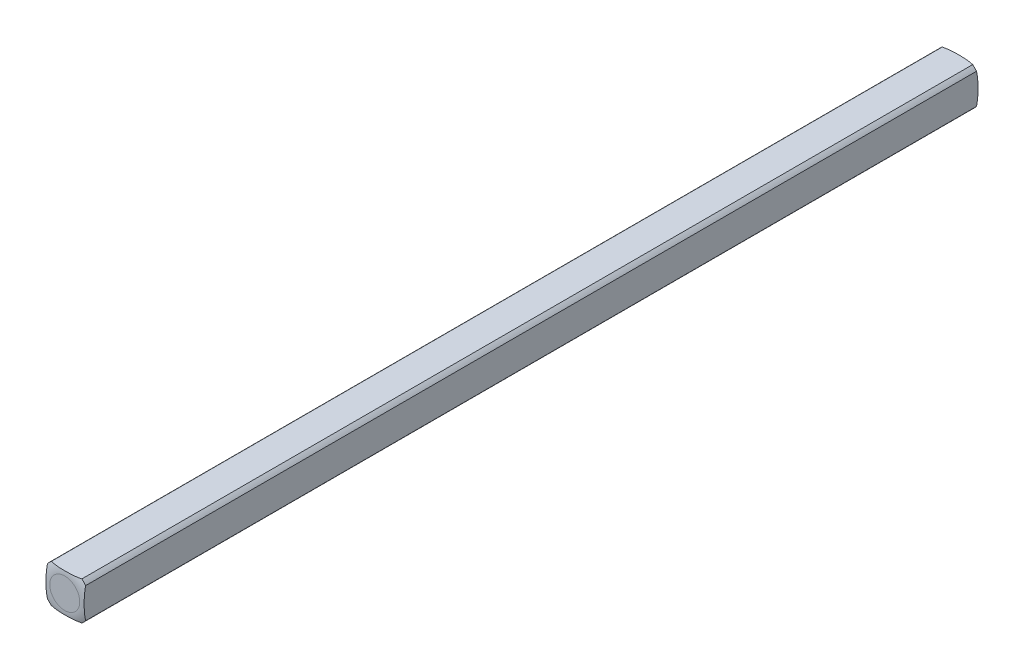
ISO-10303-21;
HEADER;
FILE_DESCRIPTION(('STEP AP214'),'2;1');
FILE_NAME('part.step','',(''),(''),'','','');
FILE_SCHEMA(('AUTOMOTIVE_DESIGN { 1 0 10303 214 1 1 1 1 }'));
ENDSEC;
DATA;
#1=APPLICATION_CONTEXT('core data for automotive mechanical design processes');
#2=APPLICATION_PROTOCOL_DEFINITION('international standard','automotive_design',2000,#1);
#3=PRODUCT_CONTEXT('',#1,'mechanical');
#4=PRODUCT('Part','Part','',(#3));
#5=PRODUCT_RELATED_PRODUCT_CATEGORY('part','',(#4));
#6=PRODUCT_DEFINITION_FORMATION('','',#4);
#7=PRODUCT_DEFINITION_CONTEXT('part definition',#1,'design');
#8=PRODUCT_DEFINITION('design','',#6,#7);
#9=PRODUCT_DEFINITION_SHAPE('','',#8);
#10=(LENGTH_UNIT() NAMED_UNIT(*) SI_UNIT(.MILLI.,.METRE.));
#11=(NAMED_UNIT(*) PLANE_ANGLE_UNIT() SI_UNIT($,.RADIAN.));
#12=(NAMED_UNIT(*) SI_UNIT($,.STERADIAN.) SOLID_ANGLE_UNIT());
#13=UNCERTAINTY_MEASURE_WITH_UNIT(LENGTH_MEASURE(1.E-05),#10,'distance_accuracy_value','');
#14=(GEOMETRIC_REPRESENTATION_CONTEXT(3) GLOBAL_UNCERTAINTY_ASSIGNED_CONTEXT((#13)) GLOBAL_UNIT_ASSIGNED_CONTEXT((#10,
#11,#12)) REPRESENTATION_CONTEXT('',''));
#15=CARTESIAN_POINT('',(0.,0.,0.));
#16=DIRECTION('',(0.,0.,1.));
#17=DIRECTION('',(1.,0.,0.));
#18=AXIS2_PLACEMENT_3D('',#15,#16,#17);
#19=CARTESIAN_POINT('',(-1.5875,-1.5875,37.211));
#20=DIRECTION('',(0.,1.,0.));
#21=DIRECTION('',(0.,0.,1.));
#22=AXIS2_PLACEMENT_3D('',#19,#20,#21);
#23=PLANE('',#22);
#24=CARTESIAN_POINT('',(1.26841150657032,-1.5875,-37.059919142098));
#25=CARTESIAN_POINT('',(1.22720105040827,-1.5875,-37.0701762604742));
#26=CARTESIAN_POINT('',(1.18578761357714,-1.5875,-37.0795927535058));
#27=CARTESIAN_POINT('',(1.10271120238514,-1.5875,-37.096861071626));
#28=CARTESIAN_POINT('',(1.06104879805324,-1.5875,-37.1047156312752));
#29=CARTESIAN_POINT('',(0.977511179219644,-1.5875,-37.1190074369776));
#30=CARTESIAN_POINT('',(0.935636116351978,-1.5875,-37.12544557827));
#31=CARTESIAN_POINT('',(0.85195632596747,-1.5875,-37.1370202217379));
#32=CARTESIAN_POINT('',(0.810152608329594,-1.5875,-37.1421640837943));
#33=CARTESIAN_POINT('',(0.726405135779092,-1.5875,-37.1513448983346));
#34=CARTESIAN_POINT('',(0.684461324130969,-1.5875,-37.1553813277516));
#35=CARTESIAN_POINT('',(0.600471089740472,-1.5875,-37.1624873965405));
#36=CARTESIAN_POINT('',(0.55842462478368,-1.5875,-37.1655565288188));
#37=CARTESIAN_POINT('',(0.442316252980614,-1.5875,-37.172876819996));
#38=CARTESIAN_POINT('',(0.368199297688235,-1.5875,-37.1762546095867));
#39=CARTESIAN_POINT('',(0.219899169562756,-1.5875,-37.1810241426145));
#40=CARTESIAN_POINT('',(0.145715990031034,-1.5875,-37.1824156550284));
#41=CARTESIAN_POINT('',(-0.00261925426802478,-1.5875,-37.1835115381934));
#42=CARTESIAN_POINT('',(-0.0767713119995585,-1.5875,-37.1832168909072));
#43=CARTESIAN_POINT('',(-0.22505583427011,-1.5875,-37.1808755268396));
#44=CARTESIAN_POINT('',(-0.299188296702211,-1.5875,-37.1788286662978));
#45=CARTESIAN_POINT('',(-0.44849139385935,-1.5875,-37.172519272075));
#46=CARTESIAN_POINT('',(-0.523660700911162,-1.5875,-37.1682235679572));
#47=CARTESIAN_POINT('',(-0.673772419103432,-1.5875,-37.1567011997426));
#48=CARTESIAN_POINT('',(-0.74871487412263,-1.5875,-37.1494751445196));
#49=CARTESIAN_POINT('',(-0.873294781040694,-1.5875,-37.1343054206116));
#50=CARTESIAN_POINT('',(-0.923058303404124,-1.5875,-37.1273998036191));
#51=CARTESIAN_POINT('',(-1.02230885751262,-1.5875,-37.1116736221696));
#52=CARTESIAN_POINT('',(-1.07179576173138,-1.5875,-37.1028522389467));
#53=CARTESIAN_POINT('',(-1.17042027552899,-1.5875,-37.0830571345187));
#54=CARTESIAN_POINT('',(-1.2195571747518,-1.58749999999998,-37.072079888906));
#55=CARTESIAN_POINT('',(-1.26841150657033,-1.58749999999996,-37.059919142098));
#56=B_SPLINE_CURVE_WITH_KNOTS('',3,(#24,#25,#26,#27,#28,#29,#30,#31,#32,#33,#34,#35,#36,#37,#38,
#39,#40,#41,#42,#43,#44,#45,#46,#47,#48,#49,#50,#51,#52,#53,#54,#55),.UNSPECIFIED.,.F.,.F.,(4,2,
2,2,2,2,2,2,2,2,2,2,2,2,2,4),(0.,0.12738566921495,0.254546315061895,0.381626357369329,
0.507966543484096,0.634366300757393,0.760832211740227,0.983375124489411,1.20594391900471,
1.42838311012148,1.65084055299026,1.87667574497213,2.10246403651328,2.25315484465146,
2.40391018266842,2.55491405868559),.UNSPECIFIED.);
#57=CARTESIAN_POINT('',(1.26841150657032,-1.5875,-37.059919142098));
#58=VERTEX_POINT('',#57);
#59=CARTESIAN_POINT('',(-1.26841150657032,-1.5875,-37.059919142098));
#60=VERTEX_POINT('',#59);
#61=EDGE_CURVE('E112',#58,#60,#56,.T.);
#62=ORIENTED_EDGE('',*,*,#61,.F.);
#63=DIRECTION('',(0.,0.,1.));
#64=VECTOR('',#63,1.);
#65=CARTESIAN_POINT('',(1.26841150657032,-1.5875,-37.211));
#66=LINE('',#65,#64);
#67=CARTESIAN_POINT('',(1.26841150657032,-1.5875,37.059919142098));
#68=VERTEX_POINT('',#67);
#69=EDGE_CURVE('E122',#68,#58,#66,.F.);
#70=ORIENTED_EDGE('',*,*,#69,.F.);
#71=CARTESIAN_POINT('',(-1.26841150657032,-1.5875,37.059919142098));
#72=CARTESIAN_POINT('',(-1.22720105040827,-1.5875,37.0701762604742));
#73=CARTESIAN_POINT('',(-1.18578761357714,-1.5875,37.0795927535058));
#74=CARTESIAN_POINT('',(-1.10271120238514,-1.5875,37.096861071626));
#75=CARTESIAN_POINT('',(-1.06104879805324,-1.5875,37.1047156312752));
#76=CARTESIAN_POINT('',(-0.977511179219647,-1.5875,37.1190074369776));
#77=CARTESIAN_POINT('',(-0.935636116351981,-1.5875,37.12544557827));
#78=CARTESIAN_POINT('',(-0.851956325967475,-1.5875,37.1370202217379));
#79=CARTESIAN_POINT('',(-0.810152608329599,-1.5875,37.1421640837943));
#80=CARTESIAN_POINT('',(-0.726405135779099,-1.5875,37.1513448983346));
#81=CARTESIAN_POINT('',(-0.684461324130976,-1.5875,37.1553813277516));
#82=CARTESIAN_POINT('',(-0.600471089740481,-1.5875,37.1624873965405));
#83=CARTESIAN_POINT('',(-0.558424624783689,-1.5875,37.1655565288188));
#84=CARTESIAN_POINT('',(-0.442316252980623,-1.5875,37.172876819996));
#85=CARTESIAN_POINT('',(-0.368199297688244,-1.5875,37.1762546095867));
#86=CARTESIAN_POINT('',(-0.219899169562765,-1.5875,37.1810241426145));
#87=CARTESIAN_POINT('',(-0.145715990031042,-1.5875,37.1824156550284));
#88=CARTESIAN_POINT('',(0.00261925426801704,-1.5875,37.1835115381934));
#89=CARTESIAN_POINT('',(0.076771311999551,-1.5875,37.1832168909072));
#90=CARTESIAN_POINT('',(0.225055834270103,-1.5875,37.1808755268396));
#91=CARTESIAN_POINT('',(0.299188296702204,-1.5875,37.1788286662978));
#92=CARTESIAN_POINT('',(0.448491393859344,-1.5875,37.172519272075));
#93=CARTESIAN_POINT('',(0.523660700911156,-1.5875,37.1682235679572));
#94=CARTESIAN_POINT('',(0.673772419103427,-1.5875,37.1567011997426));
#95=CARTESIAN_POINT('',(0.748714874122625,-1.5875,37.1494751445196));
#96=CARTESIAN_POINT('',(0.873294781040689,-1.5875,37.1343054206116));
#97=CARTESIAN_POINT('',(0.92305830340412,-1.5875,37.1273998036191));
#98=CARTESIAN_POINT('',(1.02230885751262,-1.5875,37.1116736221696));
#99=CARTESIAN_POINT('',(1.07179576173137,-1.5875,37.1028522389467));
#100=CARTESIAN_POINT('',(1.17042027552899,-1.5875,37.0830571345187));
#101=CARTESIAN_POINT('',(1.21955717475179,-1.58749999999998,37.072079888906));
#102=CARTESIAN_POINT('',(1.26841150657032,-1.58749999999996,37.059919142098));
#103=B_SPLINE_CURVE_WITH_KNOTS('',3,(#71,#72,#73,#74,#75,#76,#77,#78,#79,#80,#81,#82,#83,#84,
#85,#86,#87,#88,#89,#90,#91,#92,#93,#94,#95,#96,#97,#98,#99,#100,#101,#102),.UNSPECIFIED.,.F.,
.F.,(4,2,2,2,2,2,2,2,2,2,2,2,2,2,2,4),(0.,0.127385669214948,0.254546315061892,0.381626357369324,
0.507966543484089,0.634366300757384,0.760832211740216,0.9833751244894,1.2059439190047,
1.42838311012148,1.65084055299025,1.87667574497213,2.10246403651327,2.25315484465145,
2.40391018266841,2.55491405868559),.UNSPECIFIED.);
#104=CARTESIAN_POINT('',(-1.26841150657032,-1.5875,37.059919142098));
#105=VERTEX_POINT('',#104);
#106=EDGE_CURVE('E87',#105,#68,#103,.T.);
#107=ORIENTED_EDGE('',*,*,#106,.F.);
#108=DIRECTION('',(0.,0.,1.));
#109=VECTOR('',#108,1.);
#110=CARTESIAN_POINT('',(-1.26841150657032,-1.5875,-37.211));
#111=LINE('',#110,#109);
#112=EDGE_CURVE('E111',#60,#105,#111,.T.);
#113=ORIENTED_EDGE('',*,*,#112,.F.);
#114=EDGE_LOOP('',(#62,#70,#107,#113));
#115=FACE_BOUND('',#114,.T.);
#116=ADVANCED_FACE('F16',(#115),#23,.F.);
#117=CARTESIAN_POINT('',(0.,0.,-37.211));
#118=DIRECTION('',(0.,0.,1.));
#119=DIRECTION('',(1.,0.,0.));
#120=AXIS2_PLACEMENT_3D('',#117,#118,#119);
#121=CYLINDRICAL_SURFACE('',#120,2.032);
#122=CARTESIAN_POINT('',(0.,0.,37.059919142098));
#123=DIRECTION('',(0.,0.,1.));
#124=DIRECTION('',(1.,0.,0.));
#125=AXIS2_PLACEMENT_3D('',#122,#123,#124);
#126=CIRCLE('',#125,2.032);
#127=CARTESIAN_POINT('',(-1.5875,-1.26841150657032,37.059919142098));
#128=VERTEX_POINT('',#127);
#129=EDGE_CURVE('E96',#105,#128,#126,.F.);
#130=ORIENTED_EDGE('',*,*,#129,.T.);
#131=DIRECTION('',(0.,0.,-1.));
#132=VECTOR('',#131,1.);
#133=CARTESIAN_POINT('',(-1.5875,-1.26841150657032,37.211));
#134=LINE('',#133,#132);
#135=CARTESIAN_POINT('',(-1.5875,-1.26841150657032,-37.059919142098));
#136=VERTEX_POINT('',#135);
#137=EDGE_CURVE('E109',#128,#136,#134,.T.);
#138=ORIENTED_EDGE('',*,*,#137,.T.);
#139=CARTESIAN_POINT('',(0.,0.,-37.059919142098));
#140=DIRECTION('',(0.,0.,1.));
#141=DIRECTION('',(1.,0.,0.));
#142=AXIS2_PLACEMENT_3D('',#139,#140,#141);
#143=CIRCLE('',#142,2.032);
#144=EDGE_CURVE('E279',#60,#136,#143,.F.);
#145=ORIENTED_EDGE('',*,*,#144,.F.);
#146=ORIENTED_EDGE('',*,*,#112,.T.);
#147=EDGE_LOOP('',(#130,#138,#145,#146));
#148=FACE_BOUND('',#147,.T.);
#149=ADVANCED_FACE('F107',(#148),#121,.T.);
#150=CARTESIAN_POINT('',(0.,0.,-37.211));
#151=DIRECTION('',(0.,0.,1.));
#152=DIRECTION('',(1.,0.,0.));
#153=AXIS2_PLACEMENT_3D('',#150,#151,#152);
#154=CYLINDRICAL_SURFACE('',#153,2.032);
#155=CARTESIAN_POINT('',(0.,0.,37.059919142098));
#156=DIRECTION('',(0.,0.,1.));
#157=DIRECTION('',(1.,0.,0.));
#158=AXIS2_PLACEMENT_3D('',#155,#156,#157);
#159=CIRCLE('',#158,2.032);
#160=CARTESIAN_POINT('',(1.5875,-1.26841150657032,37.059919142098));
#161=VERTEX_POINT('',#160);
#162=EDGE_CURVE('E278',#161,#68,#159,.F.);
#163=ORIENTED_EDGE('',*,*,#162,.T.);
#164=ORIENTED_EDGE('',*,*,#69,.T.);
#165=CARTESIAN_POINT('',(0.,0.,-37.059919142098));
#166=DIRECTION('',(0.,0.,1.));
#167=DIRECTION('',(1.,0.,0.));
#168=AXIS2_PLACEMENT_3D('',#165,#166,#167);
#169=CIRCLE('',#168,2.032);
#170=CARTESIAN_POINT('',(1.5875,-1.26841150657032,-37.059919142098));
#171=VERTEX_POINT('',#170);
#172=EDGE_CURVE('E167',#58,#171,#169,.T.);
#173=ORIENTED_EDGE('',*,*,#172,.T.);
#174=DIRECTION('',(0.,0.,1.));
#175=VECTOR('',#174,1.);
#176=CARTESIAN_POINT('',(1.5875,-1.26841150657032,37.211));
#177=LINE('',#176,#175);
#178=EDGE_CURVE('E189',#171,#161,#177,.T.);
#179=ORIENTED_EDGE('',*,*,#178,.T.);
#180=EDGE_LOOP('',(#163,#164,#173,#179));
#181=FACE_BOUND('',#180,.T.);
#182=ADVANCED_FACE('F149',(#181),#154,.T.);
#183=CARTESIAN_POINT('',(-1.5875,1.5875,37.211));
#184=DIRECTION('',(0.,0.,-1.));
#185=DIRECTION('',(-1.,0.,0.));
#186=AXIS2_PLACEMENT_3D('',#183,#184,#185);
#187=PLANE('',#186);
#188=CARTESIAN_POINT('',(0.,0.,37.211));
#189=DIRECTION('',(0.,0.,-1.));
#190=DIRECTION('',(1.,0.,0.));
#191=AXIS2_PLACEMENT_3D('',#188,#189,#190);
#192=CIRCLE('',#191,1.24506403026729);
#193=CARTESIAN_POINT('',(1.24506403026729,0.,37.211));
#194=VERTEX_POINT('',#193);
#195=CARTESIAN_POINT('',(-1.24506403026729,0.,37.211));
#196=VERTEX_POINT('',#195);
#197=EDGE_CURVE('E117',#194,#196,#192,.T.);
#198=ORIENTED_EDGE('',*,*,#197,.F.);
#199=CARTESIAN_POINT('',(0.,0.,37.211));
#200=DIRECTION('',(0.,0.,-1.));
#201=DIRECTION('',(-1.,0.,0.));
#202=AXIS2_PLACEMENT_3D('',#199,#200,#201);
#203=CIRCLE('',#202,1.24506403026729);
#204=EDGE_CURVE('E163',#196,#194,#203,.T.);
#205=ORIENTED_EDGE('',*,*,#204,.F.);
#206=EDGE_LOOP('',(#198,#205));
#207=FACE_BOUND('',#206,.T.);
#208=ADVANCED_FACE('F139',(#207),#187,.F.);
#209=CARTESIAN_POINT('',(-1.5875,-1.5875,37.211));
#210=DIRECTION('',(1.,0.,0.));
#211=DIRECTION('',(0.,0.,-1.));
#212=AXIS2_PLACEMENT_3D('',#209,#210,#211);
#213=PLANE('',#212);
#214=CARTESIAN_POINT('',(-1.5875,-1.26841150657032,-37.059919142098));
#215=CARTESIAN_POINT('',(-1.5875,-1.1449330903041,-37.0906460633221));
#216=CARTESIAN_POINT('',(-1.5875,-1.01998399304383,-37.1137556661494));
#217=CARTESIAN_POINT('',(-1.5875,-0.768859486803923,-37.1485369425311));
#218=CARTESIAN_POINT('',(-1.5875,-0.642689416140628,-37.160245727962));
#219=CARTESIAN_POINT('',(-1.5875,-0.430424575859619,-37.1736252995166));
#220=CARTESIAN_POINT('',(-1.5875,-0.344419790998911,-37.1773089066951));
#221=CARTESIAN_POINT('',(-1.5875,-0.172275750609256,-37.1821119883047));
#222=CARTESIAN_POINT('',(-1.5875,-0.0861364440860026,-37.1832298028463));
#223=CARTESIAN_POINT('',(-1.5875,0.0708815141524197,-37.1832253528724));
#224=CARTESIAN_POINT('',(-1.5875,0.141761089973269,-37.1824647503116));
#225=CARTESIAN_POINT('',(-1.5875,0.283443517066233,-37.1792632283593));
#226=CARTESIAN_POINT('',(-1.5875,0.354246388904852,-37.1768233071219));
#227=CARTESIAN_POINT('',(-1.5875,0.495806846039993,-37.1698353290476));
#228=CARTESIAN_POINT('',(-1.5875,0.566564357181161,-37.1652856874328));
#229=CARTESIAN_POINT('',(-1.5875,0.707839358368324,-37.1534687398624));
#230=CARTESIAN_POINT('',(-1.5875,0.77835691039061,-37.1462021995255));
#231=CARTESIAN_POINT('',(-1.5875,0.91922385926538,-37.1282291029893));
#232=CARTESIAN_POINT('',(-1.5875,0.989571770847696,-37.1175104282261));
#233=CARTESIAN_POINT('',(-1.5875,1.12959917493505,-37.0919650360794));
#234=CARTESIAN_POINT('',(-1.5875,1.19927774910522,-37.0771333317905));
#235=CARTESIAN_POINT('',(-1.5875,1.26841150657032,-37.059919142098));
#236=B_SPLINE_CURVE_WITH_KNOTS('',3,(#214,#215,#216,#217,#218,#219,#220,#221,#222,#223,#224,
#225,#226,#227,#228,#229,#230,#231,#232,#233,#234,#235),.UNSPECIFIED.,.F.,.F.,(4,2,2,2,2,2,2,2,
2,2,4),(0.,0.380919121752895,0.760594090647793,1.01882661939087,1.27722615960104,
1.48986264420096,1.70237285085079,1.91504294996344,2.12765316402353,2.34101802413352,
2.55464272138866),.UNSPECIFIED.);
#237=CARTESIAN_POINT('',(-1.5875,1.26841150657032,-37.059919142098));
#238=VERTEX_POINT('',#237);
#239=EDGE_CURVE('E115',#136,#238,#236,.T.);
#240=ORIENTED_EDGE('',*,*,#239,.F.);
#241=ORIENTED_EDGE('',*,*,#137,.F.);
#242=CARTESIAN_POINT('',(-1.5875,1.26841150657032,37.059919142098));
#243=CARTESIAN_POINT('',(-1.5875,1.1449330903041,37.0906460633221));
#244=CARTESIAN_POINT('',(-1.5875,1.01998399304384,37.1137556661494));
#245=CARTESIAN_POINT('',(-1.5875,0.768859486803937,37.1485369425311));
#246=CARTESIAN_POINT('',(-1.5875,0.642689416140646,37.160245727962));
#247=CARTESIAN_POINT('',(-1.5875,0.430424575859638,37.1736252995166));
#248=CARTESIAN_POINT('',(-1.5875,0.344419790998926,37.1773089066951));
#249=CARTESIAN_POINT('',(-1.5875,0.172275750609264,37.1821119883047));
#250=CARTESIAN_POINT('',(-1.5875,0.0861364440860064,37.1832298028463));
#251=CARTESIAN_POINT('',(-1.5875,-0.0708815141524197,37.1832253528724));
#252=CARTESIAN_POINT('',(-1.5875,-0.141761089973269,37.1824647503116));
#253=CARTESIAN_POINT('',(-1.5875,-0.283443517066233,37.1792632283593));
#254=CARTESIAN_POINT('',(-1.5875,-0.354246388904852,37.1768233071219));
#255=CARTESIAN_POINT('',(-1.5875,-0.495806846039993,37.1698353290476));
#256=CARTESIAN_POINT('',(-1.5875,-0.566564357181161,37.1652856874328));
#257=CARTESIAN_POINT('',(-1.5875,-0.707839358368324,37.1534687398624));
#258=CARTESIAN_POINT('',(-1.5875,-0.77835691039061,37.1462021995255));
#259=CARTESIAN_POINT('',(-1.5875,-0.91922385926538,37.1282291029893));
#260=CARTESIAN_POINT('',(-1.5875,-0.989571770847696,37.1175104282261));
#261=CARTESIAN_POINT('',(-1.5875,-1.12959917493505,37.0919650360794));
#262=CARTESIAN_POINT('',(-1.5875,-1.19927774910522,37.0771333317905));
#263=CARTESIAN_POINT('',(-1.5875,-1.26841150657032,37.059919142098));
#264=B_SPLINE_CURVE_WITH_KNOTS('',3,(#242,#243,#244,#245,#246,#247,#248,#249,#250,#251,#252,
#253,#254,#255,#256,#257,#258,#259,#260,#261,#262,#263),.UNSPECIFIED.,.F.,.F.,(4,2,2,2,2,2,2,2,
2,2,4),(0.,0.380919121752883,0.760594090647769,1.01882661939086,1.27722615960103,
1.48986264420096,1.70237285085079,1.91504294996343,2.12765316402352,2.34101802413351,
2.55464272138866),.UNSPECIFIED.);
#265=CARTESIAN_POINT('',(-1.5875,1.26841150657032,37.059919142098));
#266=VERTEX_POINT('',#265);
#267=EDGE_CURVE('E92',#266,#128,#264,.T.);
#268=ORIENTED_EDGE('',*,*,#267,.F.);
#269=DIRECTION('',(0.,0.,1.));
#270=VECTOR('',#269,1.);
#271=CARTESIAN_POINT('',(-1.5875,1.26841150657032,-37.211));
#272=LINE('',#271,#270);
#273=EDGE_CURVE('E102',#238,#266,#272,.T.);
#274=ORIENTED_EDGE('',*,*,#273,.F.);
#275=EDGE_LOOP('',(#240,#241,#268,#274));
#276=FACE_BOUND('',#275,.T.);
#277=ADVANCED_FACE('F114',(#276),#213,.F.);
#278=CARTESIAN_POINT('',(-1.5875,1.5875,-37.211));
#279=DIRECTION('',(0.,0.,-1.));
#280=DIRECTION('',(-1.,0.,0.));
#281=AXIS2_PLACEMENT_3D('',#278,#279,#280);
#282=PLANE('',#281);
#283=CARTESIAN_POINT('',(0.,0.,-37.211));
#284=DIRECTION('',(0.,0.,1.));
#285=DIRECTION('',(1.,0.,0.));
#286=AXIS2_PLACEMENT_3D('',#283,#284,#285);
#287=CIRCLE('',#286,1.24506403026729);
#288=CARTESIAN_POINT('',(1.24506403026729,0.,-37.211));
#289=VERTEX_POINT('',#288);
#290=CARTESIAN_POINT('',(-1.24506403026729,0.,-37.211));
#291=VERTEX_POINT('',#290);
#292=EDGE_CURVE('E202',#289,#291,#287,.T.);
#293=ORIENTED_EDGE('',*,*,#292,.F.);
#294=CARTESIAN_POINT('',(0.,0.,-37.211));
#295=DIRECTION('',(0.,0.,1.));
#296=DIRECTION('',(-1.,0.,0.));
#297=AXIS2_PLACEMENT_3D('',#294,#295,#296);
#298=CIRCLE('',#297,1.24506403026729);
#299=EDGE_CURVE('E119',#289,#291,#298,.F.);
#300=ORIENTED_EDGE('',*,*,#299,.T.);
#301=EDGE_LOOP('',(#293,#300));
#302=FACE_BOUND('',#301,.T.);
#303=ADVANCED_FACE('F207',(#302),#282,.T.);
#304=CARTESIAN_POINT('',(1.5875,-1.5875,37.211));
#305=DIRECTION('',(-1.,0.,0.));
#306=DIRECTION('',(0.,0.,1.));
#307=AXIS2_PLACEMENT_3D('',#304,#305,#306);
#308=PLANE('',#307);
#309=ORIENTED_EDGE('',*,*,#178,.F.);
#310=CARTESIAN_POINT('',(1.5875,1.26841150657032,-37.059919142098));
#311=CARTESIAN_POINT('',(1.5875,1.1449330903041,-37.0906460633221));
#312=CARTESIAN_POINT('',(1.5875,1.01998399304383,-37.1137556661494));
#313=CARTESIAN_POINT('',(1.5875,0.768859486803923,-37.1485369425311));
#314=CARTESIAN_POINT('',(1.5875,0.642689416140628,-37.160245727962));
#315=CARTESIAN_POINT('',(1.5875,0.43042457585962,-37.1736252995166));
#316=CARTESIAN_POINT('',(1.5875,0.344419790998911,-37.1773089066951));
#317=CARTESIAN_POINT('',(1.5875,0.172275750609257,-37.1821119883047));
#318=CARTESIAN_POINT('',(1.5875,0.0861364440860028,-37.1832298028463));
#319=CARTESIAN_POINT('',(1.5875,-0.0708815141524195,-37.1832253528724));
#320=CARTESIAN_POINT('',(1.5875,-0.141761089973269,-37.1824647503116));
#321=CARTESIAN_POINT('',(1.5875,-0.283443517066233,-37.1792632283593));
#322=CARTESIAN_POINT('',(1.5875,-0.354246388904852,-37.1768233071219));
#323=CARTESIAN_POINT('',(1.5875,-0.495806846039992,-37.1698353290476));
#324=CARTESIAN_POINT('',(1.5875,-0.566564357181161,-37.1652856874328));
#325=CARTESIAN_POINT('',(1.5875,-0.707839358368324,-37.1534687398624));
#326=CARTESIAN_POINT('',(1.5875,-0.778356910390611,-37.1462021995255));
#327=CARTESIAN_POINT('',(1.5875,-0.919223859265381,-37.1282291029893));
#328=CARTESIAN_POINT('',(1.5875,-0.989571770847697,-37.1175104282261));
#329=CARTESIAN_POINT('',(1.5875,-1.12959917493506,-37.0919650360794));
#330=CARTESIAN_POINT('',(1.5875,-1.19927774910522,-37.0771333317905));
#331=CARTESIAN_POINT('',(1.5875,-1.26841150657033,-37.059919142098));
#332=B_SPLINE_CURVE_WITH_KNOTS('',3,(#310,#311,#312,#313,#314,#315,#316,#317,#318,#319,#320,
#321,#322,#323,#324,#325,#326,#327,#328,#329,#330,#331),.UNSPECIFIED.,.F.,.F.,(4,2,2,2,2,2,2,2,
2,2,4),(0.,0.380919121752895,0.760594090647793,1.01882661939087,1.27722615960104,
1.48986264420096,1.70237285085079,1.91504294996344,2.12765316402353,2.34101802413352,
2.55464272138866),.UNSPECIFIED.);
#333=CARTESIAN_POINT('',(1.5875,1.26841150657032,-37.059919142098));
#334=VERTEX_POINT('',#333);
#335=EDGE_CURVE('E230',#334,#171,#332,.T.);
#336=ORIENTED_EDGE('',*,*,#335,.F.);
#337=DIRECTION('',(0.,0.,1.));
#338=VECTOR('',#337,1.);
#339=CARTESIAN_POINT('',(1.5875,1.26841150657032,-37.211));
#340=LINE('',#339,#338);
#341=CARTESIAN_POINT('',(1.5875,1.26841150657032,37.059919142098));
#342=VERTEX_POINT('',#341);
#343=EDGE_CURVE('E192',#342,#334,#340,.F.);
#344=ORIENTED_EDGE('',*,*,#343,.F.);
#345=CARTESIAN_POINT('',(1.5875,-1.26841150657032,37.059919142098));
#346=CARTESIAN_POINT('',(1.5875,-1.1449330903041,37.0906460633221));
#347=CARTESIAN_POINT('',(1.5875,-1.01998399304383,37.1137556661494));
#348=CARTESIAN_POINT('',(1.5875,-0.768859486803923,37.1485369425311));
#349=CARTESIAN_POINT('',(1.5875,-0.642689416140628,37.160245727962));
#350=CARTESIAN_POINT('',(1.5875,-0.43042457585962,37.1736252995166));
#351=CARTESIAN_POINT('',(1.5875,-0.344419790998911,37.1773089066951));
#352=CARTESIAN_POINT('',(1.5875,-0.172275750609257,37.1821119883047));
#353=CARTESIAN_POINT('',(1.5875,-0.0861364440860028,37.1832298028463));
#354=CARTESIAN_POINT('',(1.5875,0.0708815141524194,37.1832253528724));
#355=CARTESIAN_POINT('',(1.5875,0.141761089973268,37.1824647503116));
#356=CARTESIAN_POINT('',(1.5875,0.283443517066233,37.1792632283593));
#357=CARTESIAN_POINT('',(1.5875,0.354246388904852,37.1768233071219));
#358=CARTESIAN_POINT('',(1.5875,0.495806846039992,37.1698353290476));
#359=CARTESIAN_POINT('',(1.5875,0.56656435718116,37.1652856874328));
#360=CARTESIAN_POINT('',(1.5875,0.707839358368323,37.1534687398624));
#361=CARTESIAN_POINT('',(1.5875,0.778356910390609,37.1462021995255));
#362=CARTESIAN_POINT('',(1.5875,0.919223859265379,37.1282291029893));
#363=CARTESIAN_POINT('',(1.5875,0.989571770847695,37.1175104282261));
#364=CARTESIAN_POINT('',(1.5875,1.12959917493505,37.0919650360794));
#365=CARTESIAN_POINT('',(1.5875,1.19927774910522,37.0771333317905));
#366=CARTESIAN_POINT('',(1.5875,1.26841150657032,37.059919142098));
#367=B_SPLINE_CURVE_WITH_KNOTS('',3,(#345,#346,#347,#348,#349,#350,#351,#352,#353,#354,#355,
#356,#357,#358,#359,#360,#361,#362,#363,#364,#365,#366),.UNSPECIFIED.,.F.,.F.,(4,2,2,2,2,2,2,2,
2,2,4),(0.,0.380919121752895,0.760594090647793,1.01882661939087,1.27722615960104,
1.48986264420096,1.70237285085079,1.91504294996343,2.12765316402352,2.34101802413351,
2.55464272138866),.UNSPECIFIED.);
#368=EDGE_CURVE('E103',#161,#342,#367,.T.);
#369=ORIENTED_EDGE('',*,*,#368,.F.);
#370=EDGE_LOOP('',(#309,#336,#344,#369));
#371=FACE_BOUND('',#370,.T.);
#372=ADVANCED_FACE('F180',(#371),#308,.F.);
#373=CARTESIAN_POINT('',(1.24506403026729,0.,35.086));
#374=DIRECTION('',(0.,-1.,0.));
#375=DIRECTION('',(1.,0.,0.));
#376=AXIS2_PLACEMENT_3D('',#373,#374,#375);
#377=CIRCLE('',#376,2.125);
#378=TRIMMED_CURVE('',#377,(PARAMETER_VALUE(-2.19680193092879)),
(PARAMETER_VALUE(2.19680193092879)),.T.,.PARAMETER.);
#379=CARTESIAN_POINT('',(0.,0.,35.086));
#380=DIRECTION('',(0.,0.,-1.));
#381=AXIS1_PLACEMENT('',#379,#380);
#382=SURFACE_OF_REVOLUTION('',#378,#381);
#383=ORIENTED_EDGE('',*,*,#267,.T.);
#384=ORIENTED_EDGE('',*,*,#129,.F.);
#385=ORIENTED_EDGE('',*,*,#106,.T.);
#386=ORIENTED_EDGE('',*,*,#162,.F.);
#387=ORIENTED_EDGE('',*,*,#368,.T.);
#388=CARTESIAN_POINT('',(0.,0.,37.059919142098));
#389=DIRECTION('',(0.,0.,1.));
#390=DIRECTION('',(1.,0.,0.));
#391=AXIS2_PLACEMENT_3D('',#388,#389,#390);
#392=CIRCLE('',#391,2.032);
#393=CARTESIAN_POINT('',(1.26841150657032,1.5875,37.059919142098));
#394=VERTEX_POINT('',#393);
#395=EDGE_CURVE('E195',#394,#342,#392,.F.);
#396=ORIENTED_EDGE('',*,*,#395,.F.);
#397=CARTESIAN_POINT('',(1.26841150657032,1.5875,37.059919142098));
#398=CARTESIAN_POINT('',(1.22720105040827,1.5875,37.0701762604742));
#399=CARTESIAN_POINT('',(1.18578761357714,1.5875,37.0795927535058));
#400=CARTESIAN_POINT('',(1.10271120238514,1.5875,37.096861071626));
#401=CARTESIAN_POINT('',(1.06104879805324,1.5875,37.1047156312752));
#402=CARTESIAN_POINT('',(0.977511179219644,1.5875,37.1190074369776));
#403=CARTESIAN_POINT('',(0.935636116351978,1.5875,37.12544557827));
#404=CARTESIAN_POINT('',(0.85195632596747,1.5875,37.1370202217379));
#405=CARTESIAN_POINT('',(0.810152608329594,1.5875,37.1421640837943));
#406=CARTESIAN_POINT('',(0.726405135779092,1.5875,37.1513448983346));
#407=CARTESIAN_POINT('',(0.684461324130969,1.5875,37.1553813277516));
#408=CARTESIAN_POINT('',(0.600471089740472,1.5875,37.1624873965405));
#409=CARTESIAN_POINT('',(0.55842462478368,1.5875,37.1655565288188));
#410=CARTESIAN_POINT('',(0.442316252980614,1.5875,37.172876819996));
#411=CARTESIAN_POINT('',(0.368199297688235,1.5875,37.1762546095867));
#412=CARTESIAN_POINT('',(0.219899169562756,1.5875,37.1810241426145));
#413=CARTESIAN_POINT('',(0.145715990031034,1.5875,37.1824156550284));
#414=CARTESIAN_POINT('',(-0.00261925426802464,1.5875,37.1835115381934));
#415=CARTESIAN_POINT('',(-0.0767713119995583,1.5875,37.1832168909072));
#416=CARTESIAN_POINT('',(-0.225055834270109,1.5875,37.1808755268396));
#417=CARTESIAN_POINT('',(-0.299188296702211,1.5875,37.1788286662978));
#418=CARTESIAN_POINT('',(-0.44849139385935,1.5875,37.172519272075));
#419=CARTESIAN_POINT('',(-0.523660700911162,1.5875,37.1682235679572));
#420=CARTESIAN_POINT('',(-0.673772419103432,1.5875,37.1567011997426));
#421=CARTESIAN_POINT('',(-0.748714874122629,1.5875,37.1494751445196));
#422=CARTESIAN_POINT('',(-0.873294781040694,1.5875,37.1343054206116));
#423=CARTESIAN_POINT('',(-0.923058303404124,1.5875,37.1273998036191));
#424=CARTESIAN_POINT('',(-1.02230885751262,1.5875,37.1116736221696));
#425=CARTESIAN_POINT('',(-1.07179576173138,1.5875,37.1028522389467));
#426=CARTESIAN_POINT('',(-1.17042027552899,1.5875,37.0830571345187));
#427=CARTESIAN_POINT('',(-1.2195571747518,1.58749999999998,37.072079888906));
#428=CARTESIAN_POINT('',(-1.26841150657033,1.58749999999996,37.059919142098));
#429=B_SPLINE_CURVE_WITH_KNOTS('',3,(#397,#398,#399,#400,#401,#402,#403,#404,#405,#406,#407,
#408,#409,#410,#411,#412,#413,#414,#415,#416,#417,#418,#419,#420,#421,#422,#423,#424,#425,#426,
#427,#428),.UNSPECIFIED.,.F.,.F.,(4,2,2,2,2,2,2,2,2,2,2,2,2,2,2,4),(0.,0.12738566921495,
0.254546315061895,0.381626357369329,0.507966543484096,0.634366300757393,0.760832211740227,
0.983375124489411,1.20594391900471,1.42838311012148,1.65084055299026,1.87667574497213,
2.10246403651328,2.25315484465146,2.40391018266841,2.55491405868559),.UNSPECIFIED.);
#430=CARTESIAN_POINT('',(-1.26841150657032,1.5875,37.059919142098));
#431=VERTEX_POINT('',#430);
#432=EDGE_CURVE('E194',#394,#431,#429,.T.);
#433=ORIENTED_EDGE('',*,*,#432,.T.);
#434=CARTESIAN_POINT('',(0.,0.,37.059919142098));
#435=DIRECTION('',(0.,0.,1.));
#436=DIRECTION('',(1.,0.,0.));
#437=AXIS2_PLACEMENT_3D('',#434,#435,#436);
#438=CIRCLE('',#437,2.032);
#439=EDGE_CURVE('E98',#266,#431,#438,.F.);
#440=ORIENTED_EDGE('',*,*,#439,.F.);
#441=EDGE_LOOP('',(#383,#384,#385,#386,#387,#396,#433,#440));
#442=FACE_BOUND('',#441,.T.);
#443=ORIENTED_EDGE('',*,*,#197,.T.);
#444=ORIENTED_EDGE('',*,*,#204,.T.);
#445=EDGE_LOOP('',(#443,#444));
#446=FACE_BOUND('',#445,.T.);
#447=ADVANCED_FACE('F94',(#442,#446),#382,.F.);
#448=CARTESIAN_POINT('',(0.,0.,-37.211));
#449=DIRECTION('',(0.,0.,1.));
#450=DIRECTION('',(1.,0.,0.));
#451=AXIS2_PLACEMENT_3D('',#448,#449,#450);
#452=CYLINDRICAL_SURFACE('',#451,2.032);
#453=ORIENTED_EDGE('',*,*,#439,.T.);
#454=DIRECTION('',(0.,0.,-1.));
#455=VECTOR('',#454,1.);
#456=CARTESIAN_POINT('',(-1.26841150657032,1.5875,37.211));
#457=LINE('',#456,#455);
#458=CARTESIAN_POINT('',(-1.26841150657032,1.5875,-37.059919142098));
#459=VERTEX_POINT('',#458);
#460=EDGE_CURVE('E235',#431,#459,#457,.T.);
#461=ORIENTED_EDGE('',*,*,#460,.T.);
#462=CARTESIAN_POINT('',(0.,0.,-37.059919142098));
#463=DIRECTION('',(0.,0.,1.));
#464=DIRECTION('',(1.,0.,0.));
#465=AXIS2_PLACEMENT_3D('',#462,#463,#464);
#466=CIRCLE('',#465,2.032);
#467=EDGE_CURVE('E229',#238,#459,#466,.F.);
#468=ORIENTED_EDGE('',*,*,#467,.F.);
#469=ORIENTED_EDGE('',*,*,#273,.T.);
#470=EDGE_LOOP('',(#453,#461,#468,#469));
#471=FACE_BOUND('',#470,.T.);
#472=ADVANCED_FACE('F179',(#471),#452,.T.);
#473=CARTESIAN_POINT('',(1.24506403026729,0.,-35.086));
#474=DIRECTION('',(0.,1.,0.));
#475=DIRECTION('',(1.,0.,0.));
#476=AXIS2_PLACEMENT_3D('',#473,#474,#475);
#477=CIRCLE('',#476,2.125);
#478=TRIMMED_CURVE('',#477,(PARAMETER_VALUE(-2.19680193092879)),
(PARAMETER_VALUE(2.19680193092879)),.T.,.PARAMETER.);
#479=CARTESIAN_POINT('',(0.,0.,-35.086));
#480=DIRECTION('',(0.,0.,1.));
#481=AXIS1_PLACEMENT('',#479,#480);
#482=SURFACE_OF_REVOLUTION('',#478,#481);
#483=ORIENTED_EDGE('',*,*,#292,.T.);
#484=ORIENTED_EDGE('',*,*,#299,.F.);
#485=EDGE_LOOP('',(#483,#484));
#486=FACE_BOUND('',#485,.T.);
#487=ORIENTED_EDGE('',*,*,#335,.T.);
#488=ORIENTED_EDGE('',*,*,#172,.F.);
#489=ORIENTED_EDGE('',*,*,#61,.T.);
#490=ORIENTED_EDGE('',*,*,#144,.T.);
#491=ORIENTED_EDGE('',*,*,#239,.T.);
#492=ORIENTED_EDGE('',*,*,#467,.T.);
#493=CARTESIAN_POINT('',(-1.26841150657032,1.5875,-37.059919142098));
#494=CARTESIAN_POINT('',(-1.22720105040827,1.5875,-37.0701762604742));
#495=CARTESIAN_POINT('',(-1.18578761357714,1.5875,-37.0795927535058));
#496=CARTESIAN_POINT('',(-1.10271120238514,1.5875,-37.096861071626));
#497=CARTESIAN_POINT('',(-1.06104879805324,1.5875,-37.1047156312752));
#498=CARTESIAN_POINT('',(-0.977511179219645,1.5875,-37.1190074369776));
#499=CARTESIAN_POINT('',(-0.935636116351978,1.5875,-37.12544557827));
#500=CARTESIAN_POINT('',(-0.851956325967471,1.5875,-37.1370202217379));
#501=CARTESIAN_POINT('',(-0.810152608329594,1.5875,-37.1421640837943));
#502=CARTESIAN_POINT('',(-0.726405135779093,1.5875,-37.1513448983346));
#503=CARTESIAN_POINT('',(-0.684461324130969,1.5875,-37.1553813277516));
#504=CARTESIAN_POINT('',(-0.600471089740473,1.5875,-37.1624873965405));
#505=CARTESIAN_POINT('',(-0.558424624783681,1.5875,-37.1655565288188));
#506=CARTESIAN_POINT('',(-0.442316252980615,1.5875,-37.172876819996));
#507=CARTESIAN_POINT('',(-0.368199297688236,1.5875,-37.1762546095867));
#508=CARTESIAN_POINT('',(-0.219899169562757,1.5875,-37.1810241426145));
#509=CARTESIAN_POINT('',(-0.145715990031035,1.5875,-37.1824156550284));
#510=CARTESIAN_POINT('',(0.0026192542680238,1.5875,-37.1835115381934));
#511=CARTESIAN_POINT('',(0.0767713119995575,1.5875,-37.1832168909072));
#512=CARTESIAN_POINT('',(0.225055834270109,1.5875,-37.1808755268396));
#513=CARTESIAN_POINT('',(0.29918829670221,1.5875,-37.1788286662978));
#514=CARTESIAN_POINT('',(0.448491393859349,1.5875,-37.172519272075));
#515=CARTESIAN_POINT('',(0.523660700911161,1.5875,-37.1682235679572));
#516=CARTESIAN_POINT('',(0.673772419103431,1.5875,-37.1567011997426));
#517=CARTESIAN_POINT('',(0.748714874122628,1.5875,-37.1494751445196));
#518=CARTESIAN_POINT('',(0.873294781040693,1.5875,-37.1343054206116));
#519=CARTESIAN_POINT('',(0.923058303404123,1.5875,-37.1273998036191));
#520=CARTESIAN_POINT('',(1.02230885751262,1.5875,-37.1116736221696));
#521=CARTESIAN_POINT('',(1.07179576173138,1.5875,-37.1028522389467));
#522=CARTESIAN_POINT('',(1.17042027552899,1.5875,-37.0830571345187));
#523=CARTESIAN_POINT('',(1.2195571747518,1.58749999999998,-37.072079888906));
#524=CARTESIAN_POINT('',(1.26841150657033,1.58749999999996,-37.059919142098));
#525=B_SPLINE_CURVE_WITH_KNOTS('',3,(#493,#494,#495,#496,#497,#498,#499,#500,#501,#502,#503,
#504,#505,#506,#507,#508,#509,#510,#511,#512,#513,#514,#515,#516,#517,#518,#519,#520,#521,#522,
#523,#524),.UNSPECIFIED.,.F.,.F.,(4,2,2,2,2,2,2,2,2,2,2,2,2,2,2,4),(0.,0.12738566921495,
0.254546315061895,0.381626357369328,0.507966543484096,0.634366300757392,0.760832211740226,
0.98337512448941,1.20594391900471,1.42838311012148,1.65084055299026,1.87667574497213,
2.10246403651328,2.25315484465145,2.40391018266841,2.55491405868559),.UNSPECIFIED.);
#526=CARTESIAN_POINT('',(1.26841150657032,1.5875,-37.059919142098));
#527=VERTEX_POINT('',#526);
#528=EDGE_CURVE('E28',#459,#527,#525,.T.);
#529=ORIENTED_EDGE('',*,*,#528,.T.);
#530=CARTESIAN_POINT('',(0.,0.,-37.059919142098));
#531=DIRECTION('',(0.,0.,1.));
#532=DIRECTION('',(1.,0.,0.));
#533=AXIS2_PLACEMENT_3D('',#530,#531,#532);
#534=CIRCLE('',#533,2.032);
#535=EDGE_CURVE('E36',#334,#527,#534,.T.);
#536=ORIENTED_EDGE('',*,*,#535,.F.);
#537=EDGE_LOOP('',(#487,#488,#489,#490,#491,#492,#529,#536));
#538=FACE_BOUND('',#537,.T.);
#539=ADVANCED_FACE('F225',(#486,#538),#482,.F.);
#540=CARTESIAN_POINT('',(0.,0.,-37.211));
#541=DIRECTION('',(0.,0.,1.));
#542=DIRECTION('',(1.,0.,0.));
#543=AXIS2_PLACEMENT_3D('',#540,#541,#542);
#544=CYLINDRICAL_SURFACE('',#543,2.032);
#545=ORIENTED_EDGE('',*,*,#395,.T.);
#546=ORIENTED_EDGE('',*,*,#343,.T.);
#547=ORIENTED_EDGE('',*,*,#535,.T.);
#548=DIRECTION('',(0.,0.,-1.));
#549=VECTOR('',#548,1.);
#550=CARTESIAN_POINT('',(1.26841150657032,1.5875,37.211));
#551=LINE('',#550,#549);
#552=EDGE_CURVE('E11',#527,#394,#551,.F.);
#553=ORIENTED_EDGE('',*,*,#552,.T.);
#554=EDGE_LOOP('',(#545,#546,#547,#553));
#555=FACE_BOUND('',#554,.T.);
#556=ADVANCED_FACE('F259',(#555),#544,.T.);
#557=CARTESIAN_POINT('',(-1.5875,1.5875,37.211));
#558=DIRECTION('',(0.,-1.,0.));
#559=DIRECTION('',(0.,0.,-1.));
#560=AXIS2_PLACEMENT_3D('',#557,#558,#559);
#561=PLANE('',#560);
#562=ORIENTED_EDGE('',*,*,#528,.F.);
#563=ORIENTED_EDGE('',*,*,#460,.F.);
#564=ORIENTED_EDGE('',*,*,#432,.F.);
#565=ORIENTED_EDGE('',*,*,#552,.F.);
#566=EDGE_LOOP('',(#562,#563,#564,#565));
#567=FACE_BOUND('',#566,.T.);
#568=ADVANCED_FACE('F238',(#567),#561,.F.);
#569=CLOSED_SHELL('',(#116,#149,#182,#208,#277,#303,#372,#447,#472,#539,#556,#568));
#570=MANIFOLD_SOLID_BREP('B1',#569);
#571=ADVANCED_BREP_SHAPE_REPRESENTATION('',(#18,#570),#14);
#572=SHAPE_DEFINITION_REPRESENTATION(#9,#571);
ENDSEC;
END-ISO-10303-21;
